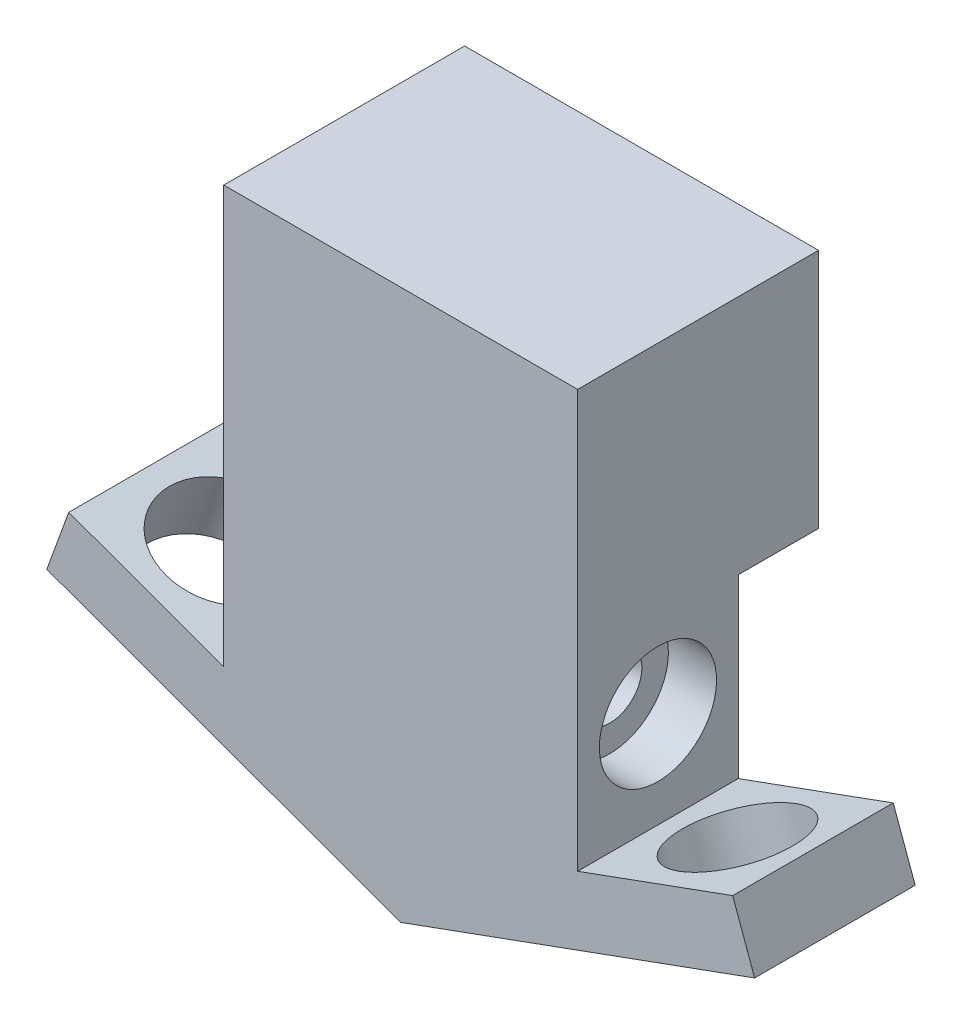
ISO-10303-21;
HEADER;
FILE_DESCRIPTION(('STEP AP214'),'2;1');
FILE_NAME('part.step','',(''),(''),'','','');
FILE_SCHEMA(('AUTOMOTIVE_DESIGN { 1 0 10303 214 1 1 1 1 }'));
ENDSEC;
DATA;
#1=APPLICATION_CONTEXT('core data for automotive mechanical design processes');
#2=APPLICATION_PROTOCOL_DEFINITION('international standard','automotive_design',2000,#1);
#3=PRODUCT_CONTEXT('',#1,'mechanical');
#4=PRODUCT('Part','Part','',(#3));
#5=PRODUCT_RELATED_PRODUCT_CATEGORY('part','',(#4));
#6=PRODUCT_DEFINITION_FORMATION('','',#4);
#7=PRODUCT_DEFINITION_CONTEXT('part definition',#1,'design');
#8=PRODUCT_DEFINITION('design','',#6,#7);
#9=PRODUCT_DEFINITION_SHAPE('','',#8);
#10=(LENGTH_UNIT() NAMED_UNIT(*) SI_UNIT(.MILLI.,.METRE.));
#11=(NAMED_UNIT(*) PLANE_ANGLE_UNIT() SI_UNIT($,.RADIAN.));
#12=(NAMED_UNIT(*) SI_UNIT($,.STERADIAN.) SOLID_ANGLE_UNIT());
#13=UNCERTAINTY_MEASURE_WITH_UNIT(LENGTH_MEASURE(1.E-05),#10,'distance_accuracy_value','');
#14=(GEOMETRIC_REPRESENTATION_CONTEXT(3) GLOBAL_UNCERTAINTY_ASSIGNED_CONTEXT((#13)) GLOBAL_UNIT_ASSIGNED_CONTEXT((#10,
#11,#12)) REPRESENTATION_CONTEXT('',''));
#15=CARTESIAN_POINT('',(0.,0.,0.));
#16=DIRECTION('',(0.,0.,1.));
#17=DIRECTION('',(1.,0.,0.));
#18=AXIS2_PLACEMENT_3D('',#15,#16,#17);
#19=CARTESIAN_POINT('',(0.,0.,10.));
#20=DIRECTION('',(-0.342020143325666,-0.939692620785909,0.));
#21=DIRECTION('',(0.939692620785909,-0.342020143325666,0.));
#22=AXIS2_PLACEMENT_3D('',#19,#20,#21);
#23=PLANE('',#22);
#24=CARTESIAN_POINT('',(-15.9747745533605,5.81434243653633,5.));
#25=DIRECTION('',(-0.342020143325666,-0.939692620785909,0.));
#26=DIRECTION('',(0.939692620785909,-0.342020143325666,0.));
#27=AXIS2_PLACEMENT_3D('',#24,#25,#26);
#28=CIRCLE('',#27,3.65);
#29=CARTESIAN_POINT('',(-12.5448964874919,4.56596891339764,5.));
#30=VERTEX_POINT('',#29);
#31=EDGE_CURVE('E194',#30,#30,#28,.T.);
#32=ORIENTED_EDGE('',*,*,#31,.T.);
#33=EDGE_LOOP('',(#32));
#34=FACE_BOUND('',#33,.T.);
#35=DIRECTION('',(-0.939692620785909,0.342020143325666,0.));
#36=VECTOR('',#35,1.);
#37=CARTESIAN_POINT('',(0.,0.,10.));
#38=LINE('',#37,#36);
#39=CARTESIAN_POINT('',(-11.0206591152963,4.01119187996233,10.));
#40=VERTEX_POINT('',#39);
#41=CARTESIAN_POINT('',(-20.67323765729,7.52444315316466,10.));
#42=VERTEX_POINT('',#41);
#43=EDGE_CURVE('E62',#40,#42,#38,.T.);
#44=ORIENTED_EDGE('',*,*,#43,.F.);
#45=DIRECTION('',(0.,0.,-1.));
#46=VECTOR('',#45,1.);
#47=CARTESIAN_POINT('',(-11.0206591152963,4.01119187996233,10.));
#48=LINE('',#47,#46);
#49=CARTESIAN_POINT('',(-11.0206591152963,4.01119187996233,0.));
#50=VERTEX_POINT('',#49);
#51=EDGE_CURVE('E192',#40,#50,#48,.T.);
#52=ORIENTED_EDGE('',*,*,#51,.T.);
#53=DIRECTION('',(-0.939692620785909,0.342020143325666,0.));
#54=VECTOR('',#53,1.);
#55=CARTESIAN_POINT('',(0.,0.,0.));
#56=LINE('',#55,#54);
#57=CARTESIAN_POINT('',(-20.67323765729,7.52444315316466,0.));
#58=VERTEX_POINT('',#57);
#59=EDGE_CURVE('E203',#50,#58,#56,.T.);
#60=ORIENTED_EDGE('',*,*,#59,.T.);
#61=DIRECTION('',(0.,0.,-1.));
#62=VECTOR('',#61,1.);
#63=CARTESIAN_POINT('',(-20.67323765729,7.52444315316466,10.));
#64=LINE('',#63,#62);
#65=EDGE_CURVE('E11',#42,#58,#64,.T.);
#66=ORIENTED_EDGE('',*,*,#65,.F.);
#67=EDGE_LOOP('',(#44,#52,#60,#66));
#68=FACE_BOUND('',#67,.T.);
#69=ADVANCED_FACE('F39',(#34,#68),#23,.F.);
#70=CARTESIAN_POINT('',(-20.67323765729,7.52444315316466,10.));
#71=DIRECTION('',(0.93969262078591,-0.342020143325664,0.));
#72=DIRECTION('',(0.342020143325664,0.93969262078591,0.));
#73=AXIS2_PLACEMENT_3D('',#70,#71,#72);
#74=PLANE('',#73);
#75=DIRECTION('',(-0.342020143325664,-0.93969262078591,0.));
#76=VECTOR('',#75,1.);
#77=CARTESIAN_POINT('',(-20.67323765729,7.52444315316466,0.));
#78=LINE('',#77,#76);
#79=CARTESIAN_POINT('',(-22.0413182305927,3.76567267002102,0.));
#80=VERTEX_POINT('',#79);
#81=EDGE_CURVE('E218',#58,#80,#78,.T.);
#82=ORIENTED_EDGE('',*,*,#81,.T.);
#83=DIRECTION('',(0.,0.,-1.));
#84=VECTOR('',#83,1.);
#85=CARTESIAN_POINT('',(-22.0413182305927,3.76567267002102,10.));
#86=LINE('',#85,#84);
#87=CARTESIAN_POINT('',(-22.0413182305927,3.76567267002102,10.));
#88=VERTEX_POINT('',#87);
#89=EDGE_CURVE('E47',#88,#80,#86,.T.);
#90=ORIENTED_EDGE('',*,*,#89,.F.);
#91=DIRECTION('',(-0.342020143325664,-0.93969262078591,0.));
#92=VECTOR('',#91,1.);
#93=CARTESIAN_POINT('',(-20.67323765729,7.52444315316466,10.));
#94=LINE('',#93,#92);
#95=EDGE_CURVE('E205',#42,#88,#94,.T.);
#96=ORIENTED_EDGE('',*,*,#95,.F.);
#97=ORIENTED_EDGE('',*,*,#65,.T.);
#98=EDGE_LOOP('',(#82,#90,#96,#97));
#99=FACE_BOUND('',#98,.T.);
#100=ADVANCED_FACE('F261',(#99),#74,.F.);
#101=CARTESIAN_POINT('',(-22.0413182305927,3.76567267002102,10.));
#102=DIRECTION('',(0.342020143325666,0.939692620785909,0.));
#103=DIRECTION('',(-0.939692620785909,0.342020143325666,0.));
#104=AXIS2_PLACEMENT_3D('',#101,#102,#103);
#105=PLANE('',#104);
#106=CARTESIAN_POINT('',(-17.3428551266631,2.05557195339269,5.));
#107=DIRECTION('',(0.342020143325666,0.939692620785909,0.));
#108=DIRECTION('',(-0.939692620785909,0.342020143325666,0.));
#109=AXIS2_PLACEMENT_3D('',#106,#107,#108);
#110=CIRCLE('',#109,3.65);
#111=CARTESIAN_POINT('',(-20.7727331925317,3.30394547653138,5.));
#112=VERTEX_POINT('',#111);
#113=EDGE_CURVE('E42',#112,#112,#110,.F.);
#114=ORIENTED_EDGE('',*,*,#113,.F.);
#115=EDGE_LOOP('',(#114));
#116=FACE_BOUND('',#115,.T.);
#117=DIRECTION('',(0.939692620785909,-0.342020143325666,0.));
#118=VECTOR('',#117,1.);
#119=CARTESIAN_POINT('',(-22.0413182305927,3.76567267002102,0.));
#120=LINE('',#119,#118);
#121=CARTESIAN_POINT('',(0.,-4.25671108990365,0.));
#122=VERTEX_POINT('',#121);
#123=EDGE_CURVE('E220',#80,#122,#120,.T.);
#124=ORIENTED_EDGE('',*,*,#123,.T.);
#125=DIRECTION('',(0.,0.,-1.));
#126=VECTOR('',#125,1.);
#127=CARTESIAN_POINT('',(0.,-4.25671108990365,10.));
#128=LINE('',#127,#126);
#129=CARTESIAN_POINT('',(0.,-4.25671108990365,10.));
#130=VERTEX_POINT('',#129);
#131=EDGE_CURVE('E232',#130,#122,#128,.T.);
#132=ORIENTED_EDGE('',*,*,#131,.F.);
#133=DIRECTION('',(0.939692620785909,-0.342020143325666,0.));
#134=VECTOR('',#133,1.);
#135=CARTESIAN_POINT('',(-22.0413182305927,3.76567267002102,10.));
#136=LINE('',#135,#134);
#137=EDGE_CURVE('E208',#88,#130,#136,.T.);
#138=ORIENTED_EDGE('',*,*,#137,.F.);
#139=ORIENTED_EDGE('',*,*,#89,.T.);
#140=EDGE_LOOP('',(#124,#132,#138,#139));
#141=FACE_BOUND('',#140,.T.);
#142=ADVANCED_FACE('F240',(#116,#141),#105,.F.);
#143=CARTESIAN_POINT('',(22.0413182305927,3.76567267002102,10.));
#144=DIRECTION('',(-0.342020143325667,0.939692620785909,0.));
#145=DIRECTION('',(-0.939692620785909,-0.342020143325667,0.));
#146=AXIS2_PLACEMENT_3D('',#143,#144,#145);
#147=PLANE('',#146);
#148=CARTESIAN_POINT('',(17.3428551266631,2.05557195339269,5.));
#149=DIRECTION('',(-0.342020143325667,0.939692620785909,0.));
#150=DIRECTION('',(-0.939692620785909,-0.342020143325667,0.));
#151=AXIS2_PLACEMENT_3D('',#148,#149,#150);
#152=CIRCLE('',#151,3.65);
#153=CARTESIAN_POINT('',(13.9129770607946,0.807198430254004,5.));
#154=VERTEX_POINT('',#153);
#155=EDGE_CURVE('E200',#154,#154,#152,.F.);
#156=ORIENTED_EDGE('',*,*,#155,.F.);
#157=EDGE_LOOP('',(#156));
#158=FACE_BOUND('',#157,.T.);
#159=DIRECTION('',(0.,0.,-1.));
#160=VECTOR('',#159,1.);
#161=CARTESIAN_POINT('',(22.0413182305927,3.76567267002102,10.));
#162=LINE('',#161,#160);
#163=CARTESIAN_POINT('',(22.0413182305927,3.76567267002102,10.));
#164=VERTEX_POINT('',#163);
#165=CARTESIAN_POINT('',(22.0413182305927,3.76567267002102,0.));
#166=VERTEX_POINT('',#165);
#167=EDGE_CURVE('E229',#164,#166,#162,.T.);
#168=ORIENTED_EDGE('',*,*,#167,.F.);
#169=DIRECTION('',(0.939692620785909,0.342020143325667,0.));
#170=VECTOR('',#169,1.);
#171=CARTESIAN_POINT('',(22.0413182305927,3.76567267002102,10.));
#172=LINE('',#171,#170);
#173=EDGE_CURVE('E210',#130,#164,#172,.T.);
#174=ORIENTED_EDGE('',*,*,#173,.F.);
#175=ORIENTED_EDGE('',*,*,#131,.T.);
#176=DIRECTION('',(0.939692620785909,0.342020143325667,0.));
#177=VECTOR('',#176,1.);
#178=CARTESIAN_POINT('',(22.0413182305927,3.76567267002102,0.));
#179=LINE('',#178,#177);
#180=EDGE_CURVE('E222',#122,#166,#179,.T.);
#181=ORIENTED_EDGE('',*,*,#180,.T.);
#182=EDGE_LOOP('',(#168,#174,#175,#181));
#183=FACE_BOUND('',#182,.T.);
#184=ADVANCED_FACE('F253',(#158,#183),#147,.F.);
#185=CARTESIAN_POINT('',(20.67323765729,7.52444315316466,10.));
#186=DIRECTION('',(-0.93969262078591,-0.342020143325664,0.));
#187=DIRECTION('',(0.342020143325664,-0.93969262078591,0.));
#188=AXIS2_PLACEMENT_3D('',#185,#186,#187);
#189=PLANE('',#188);
#190=DIRECTION('',(-0.342020143325664,0.93969262078591,0.));
#191=VECTOR('',#190,1.);
#192=CARTESIAN_POINT('',(20.67323765729,7.52444315316466,0.));
#193=LINE('',#192,#191);
#194=CARTESIAN_POINT('',(20.67323765729,7.52444315316466,0.));
#195=VERTEX_POINT('',#194);
#196=EDGE_CURVE('E224',#166,#195,#193,.T.);
#197=ORIENTED_EDGE('',*,*,#196,.T.);
#198=DIRECTION('',(0.,0.,-1.));
#199=VECTOR('',#198,1.);
#200=CARTESIAN_POINT('',(20.67323765729,7.52444315316466,10.));
#201=LINE('',#200,#199);
#202=CARTESIAN_POINT('',(20.67323765729,7.52444315316466,10.));
#203=VERTEX_POINT('',#202);
#204=EDGE_CURVE('E216',#203,#195,#201,.T.);
#205=ORIENTED_EDGE('',*,*,#204,.F.);
#206=DIRECTION('',(-0.342020143325664,0.93969262078591,0.));
#207=VECTOR('',#206,1.);
#208=CARTESIAN_POINT('',(20.67323765729,7.52444315316466,10.));
#209=LINE('',#208,#207);
#210=EDGE_CURVE('E212',#164,#203,#209,.T.);
#211=ORIENTED_EDGE('',*,*,#210,.F.);
#212=ORIENTED_EDGE('',*,*,#167,.T.);
#213=EDGE_LOOP('',(#197,#205,#211,#212));
#214=FACE_BOUND('',#213,.T.);
#215=ADVANCED_FACE('F257',(#214),#189,.F.);
#216=CARTESIAN_POINT('',(0.,0.,10.));
#217=DIRECTION('',(0.342020143325666,-0.939692620785909,0.));
#218=DIRECTION('',(0.939692620785909,0.342020143325666,0.));
#219=AXIS2_PLACEMENT_3D('',#216,#217,#218);
#220=PLANE('',#219);
#221=CARTESIAN_POINT('',(15.9747745533605,5.81434243653633,5.));
#222=DIRECTION('',(-0.342020143325666,0.939692620785909,0.));
#223=DIRECTION('',(-0.939692620785909,-0.342020143325666,0.));
#224=AXIS2_PLACEMENT_3D('',#221,#222,#223);
#225=CIRCLE('',#224,3.65);
#226=CARTESIAN_POINT('',(12.5448964874919,4.56596891339764,5.));
#227=VERTEX_POINT('',#226);
#228=EDGE_CURVE('E197',#227,#227,#225,.T.);
#229=ORIENTED_EDGE('',*,*,#228,.F.);
#230=EDGE_LOOP('',(#229));
#231=FACE_BOUND('',#230,.T.);
#232=DIRECTION('',(-0.939692620785909,-0.342020143325666,0.));
#233=VECTOR('',#232,1.);
#234=CARTESIAN_POINT('',(0.,0.,0.));
#235=LINE('',#234,#233);
#236=CARTESIAN_POINT('',(11.0206591152963,4.01119187996233,0.));
#237=VERTEX_POINT('',#236);
#238=EDGE_CURVE('E206',#195,#237,#235,.T.);
#239=ORIENTED_EDGE('',*,*,#238,.T.);
#240=DIRECTION('',(0.,0.,1.));
#241=VECTOR('',#240,1.);
#242=CARTESIAN_POINT('',(11.0206591152963,4.01119187996233,10.));
#243=LINE('',#242,#241);
#244=CARTESIAN_POINT('',(11.0206591152963,4.01119187996233,10.));
#245=VERTEX_POINT('',#244);
#246=EDGE_CURVE('E54',#237,#245,#243,.T.);
#247=ORIENTED_EDGE('',*,*,#246,.T.);
#248=DIRECTION('',(-0.939692620785909,-0.342020143325666,0.));
#249=VECTOR('',#248,1.);
#250=CARTESIAN_POINT('',(0.,0.,10.));
#251=LINE('',#250,#249);
#252=EDGE_CURVE('E214',#203,#245,#251,.T.);
#253=ORIENTED_EDGE('',*,*,#252,.F.);
#254=ORIENTED_EDGE('',*,*,#204,.T.);
#255=EDGE_LOOP('',(#239,#247,#253,#254));
#256=FACE_BOUND('',#255,.T.);
#257=ADVANCED_FACE('F268',(#231,#256),#220,.F.);
#258=CARTESIAN_POINT('',(0.,0.,10.));
#259=DIRECTION('',(0.,0.,1.));
#260=DIRECTION('',(1.,0.,0.));
#261=AXIS2_PLACEMENT_3D('',#258,#259,#260);
#262=PLANE('',#261);
#263=DIRECTION('',(0.,-1.,0.));
#264=VECTOR('',#263,1.);
#265=CARTESIAN_POINT('',(-11.0206591152963,-0.245519209941317,10.));
#266=LINE('',#265,#264);
#267=CARTESIAN_POINT('',(-11.0206591152963,30.,10.));
#268=VERTEX_POINT('',#267);
#269=EDGE_CURVE('E182',#268,#40,#266,.T.);
#270=ORIENTED_EDGE('',*,*,#269,.T.);
#271=ORIENTED_EDGE('',*,*,#43,.T.);
#272=ORIENTED_EDGE('',*,*,#95,.T.);
#273=ORIENTED_EDGE('',*,*,#137,.T.);
#274=ORIENTED_EDGE('',*,*,#173,.T.);
#275=ORIENTED_EDGE('',*,*,#210,.T.);
#276=ORIENTED_EDGE('',*,*,#252,.T.);
#277=DIRECTION('',(0.,1.,0.));
#278=VECTOR('',#277,1.);
#279=CARTESIAN_POINT('',(11.0206591152963,15.,10.));
#280=LINE('',#279,#278);
#281=CARTESIAN_POINT('',(11.0206591152963,30.,10.));
#282=VERTEX_POINT('',#281);
#283=EDGE_CURVE('E175',#245,#282,#280,.T.);
#284=ORIENTED_EDGE('',*,*,#283,.T.);
#285=DIRECTION('',(-1.,0.,0.));
#286=VECTOR('',#285,1.);
#287=CARTESIAN_POINT('',(32.2338625508928,30.,10.));
#288=LINE('',#287,#286);
#289=EDGE_CURVE('E147',#282,#268,#288,.T.);
#290=ORIENTED_EDGE('',*,*,#289,.T.);
#291=EDGE_LOOP('',(#270,#271,#272,#273,#274,#275,#276,#284,#290));
#292=FACE_BOUND('',#291,.T.);
#293=ADVANCED_FACE('F260',(#292),#262,.T.);
#294=CARTESIAN_POINT('',(0.,0.,0.));
#295=DIRECTION('',(0.,0.,1.));
#296=DIRECTION('',(1.,0.,0.));
#297=AXIS2_PLACEMENT_3D('',#294,#295,#296);
#298=PLANE('',#297);
#299=ORIENTED_EDGE('',*,*,#59,.F.);
#300=DIRECTION('',(0.,1.,0.));
#301=VECTOR('',#300,1.);
#302=CARTESIAN_POINT('',(-11.0206591152963,-0.245519209941317,0.));
#303=LINE('',#302,#301);
#304=CARTESIAN_POINT('',(-11.0206591152963,15.,0.));
#305=VERTEX_POINT('',#304);
#306=EDGE_CURVE('E181',#50,#305,#303,.T.);
#307=ORIENTED_EDGE('',*,*,#306,.T.);
#308=DIRECTION('',(1.,0.,0.));
#309=VECTOR('',#308,1.);
#310=CARTESIAN_POINT('',(-11.0206591152963,15.,0.));
#311=LINE('',#310,#309);
#312=CARTESIAN_POINT('',(11.0206591152963,15.,0.));
#313=VERTEX_POINT('',#312);
#314=EDGE_CURVE('E178',#305,#313,#311,.T.);
#315=ORIENTED_EDGE('',*,*,#314,.T.);
#316=DIRECTION('',(0.,-1.,0.));
#317=VECTOR('',#316,1.);
#318=CARTESIAN_POINT('',(11.0206591152963,15.,0.));
#319=LINE('',#318,#317);
#320=EDGE_CURVE('E185',#313,#237,#319,.T.);
#321=ORIENTED_EDGE('',*,*,#320,.T.);
#322=ORIENTED_EDGE('',*,*,#238,.F.);
#323=ORIENTED_EDGE('',*,*,#196,.F.);
#324=ORIENTED_EDGE('',*,*,#180,.F.);
#325=ORIENTED_EDGE('',*,*,#123,.F.);
#326=ORIENTED_EDGE('',*,*,#81,.F.);
#327=EDGE_LOOP('',(#299,#307,#315,#321,#322,#323,#324,#325,#326));
#328=FACE_BOUND('',#327,.T.);
#329=ADVANCED_FACE('F248',(#328),#298,.F.);
#330=CARTESIAN_POINT('',(20.8737886613235,-7.64558820268198,5.));
#331=DIRECTION('',(-0.342020143325666,0.939692620785909,0.));
#332=DIRECTION('',(-0.939692620785909,-0.342020143325666,0.));
#333=AXIS2_PLACEMENT_3D('',#330,#331,#332);
#334=CYLINDRICAL_SURFACE('',#333,3.65);
#335=ORIENTED_EDGE('',*,*,#155,.T.);
#336=EDGE_LOOP('',(#335));
#337=FACE_BOUND('',#336,.T.);
#338=ORIENTED_EDGE('',*,*,#228,.T.);
#339=EDGE_LOOP('',(#338));
#340=FACE_BOUND('',#339,.T.);
#341=ADVANCED_FACE('F291',(#337,#340),#334,.F.);
#342=CARTESIAN_POINT('',(-26.7096094546566,-23.6793740563484,5.));
#343=DIRECTION('',(0.342020143325666,0.939692620785909,0.));
#344=DIRECTION('',(-0.939692620785909,0.342020143325666,0.));
#345=AXIS2_PLACEMENT_3D('',#342,#343,#344);
#346=CYLINDRICAL_SURFACE('',#345,3.65);
#347=ORIENTED_EDGE('',*,*,#31,.F.);
#348=EDGE_LOOP('',(#347));
#349=FACE_BOUND('',#348,.T.);
#350=ORIENTED_EDGE('',*,*,#113,.T.);
#351=EDGE_LOOP('',(#350));
#352=FACE_BOUND('',#351,.T.);
#353=ADVANCED_FACE('F288',(#349,#352),#346,.F.);
#354=CARTESIAN_POINT('',(-11.0206591152963,-0.245519209941317,-29.2684237932669));
#355=DIRECTION('',(-1.,0.,0.));
#356=DIRECTION('',(0.,0.,1.));
#357=AXIS2_PLACEMENT_3D('',#354,#355,#356);
#358=PLANE('',#357);
#359=CARTESIAN_POINT('',(-11.0206591152963,10.,5.));
#360=DIRECTION('',(1.,0.,0.));
#361=DIRECTION('',(0.,1.,0.));
#362=AXIS2_PLACEMENT_3D('',#359,#360,#361);
#363=CIRCLE('',#362,3.65);
#364=CARTESIAN_POINT('',(-11.0206591152963,13.65,5.));
#365=VERTEX_POINT('',#364);
#366=EDGE_CURVE('E165',#365,#365,#363,.T.);
#367=ORIENTED_EDGE('',*,*,#366,.T.);
#368=EDGE_LOOP('',(#367));
#369=FACE_BOUND('',#368,.T.);
#370=ORIENTED_EDGE('',*,*,#51,.F.);
#371=ORIENTED_EDGE('',*,*,#269,.F.);
#372=DIRECTION('',(0.,0.,-1.));
#373=VECTOR('',#372,1.);
#374=CARTESIAN_POINT('',(-11.0206591152963,30.,10.));
#375=LINE('',#374,#373);
#376=CARTESIAN_POINT('',(-11.0206591152963,30.,-5.));
#377=VERTEX_POINT('',#376);
#378=EDGE_CURVE('E154',#268,#377,#375,.T.);
#379=ORIENTED_EDGE('',*,*,#378,.T.);
#380=DIRECTION('',(0.,-1.,0.));
#381=VECTOR('',#380,1.);
#382=CARTESIAN_POINT('',(-11.0206591152963,15.,-5.));
#383=LINE('',#382,#381);
#384=CARTESIAN_POINT('',(-11.0206591152963,15.,-5.));
#385=VERTEX_POINT('',#384);
#386=EDGE_CURVE('E140',#377,#385,#383,.T.);
#387=ORIENTED_EDGE('',*,*,#386,.T.);
#388=DIRECTION('',(0.,0.,1.));
#389=VECTOR('',#388,1.);
#390=CARTESIAN_POINT('',(-11.0206591152963,15.,10.));
#391=LINE('',#390,#389);
#392=EDGE_CURVE('E148',#385,#305,#391,.T.);
#393=ORIENTED_EDGE('',*,*,#392,.T.);
#394=ORIENTED_EDGE('',*,*,#306,.F.);
#395=EDGE_LOOP('',(#370,#371,#379,#387,#393,#394));
#396=FACE_BOUND('',#395,.T.);
#397=ADVANCED_FACE('F264',(#369,#396),#358,.T.);
#398=CARTESIAN_POINT('',(11.0206591152963,15.,-29.2684237932669));
#399=DIRECTION('',(1.,0.,0.));
#400=DIRECTION('',(0.,1.,0.));
#401=AXIS2_PLACEMENT_3D('',#398,#399,#400);
#402=PLANE('',#401);
#403=CARTESIAN_POINT('',(11.0206591152963,10.,5.));
#404=DIRECTION('',(1.,0.,0.));
#405=DIRECTION('',(0.,1.,0.));
#406=AXIS2_PLACEMENT_3D('',#403,#404,#405);
#407=CIRCLE('',#406,3.65);
#408=CARTESIAN_POINT('',(11.0206591152963,13.65,5.));
#409=VERTEX_POINT('',#408);
#410=EDGE_CURVE('E169',#409,#409,#407,.T.);
#411=ORIENTED_EDGE('',*,*,#410,.F.);
#412=EDGE_LOOP('',(#411));
#413=FACE_BOUND('',#412,.T.);
#414=ORIENTED_EDGE('',*,*,#246,.F.);
#415=ORIENTED_EDGE('',*,*,#320,.F.);
#416=DIRECTION('',(0.,0.,1.));
#417=VECTOR('',#416,1.);
#418=CARTESIAN_POINT('',(11.0206591152963,15.,10.));
#419=LINE('',#418,#417);
#420=CARTESIAN_POINT('',(11.0206591152963,15.,-5.));
#421=VERTEX_POINT('',#420);
#422=EDGE_CURVE('E131',#421,#313,#419,.T.);
#423=ORIENTED_EDGE('',*,*,#422,.F.);
#424=DIRECTION('',(0.,-1.,0.));
#425=VECTOR('',#424,1.);
#426=CARTESIAN_POINT('',(11.0206591152963,15.,-5.));
#427=LINE('',#426,#425);
#428=CARTESIAN_POINT('',(11.0206591152963,30.,-5.));
#429=VERTEX_POINT('',#428);
#430=EDGE_CURVE('E123',#429,#421,#427,.T.);
#431=ORIENTED_EDGE('',*,*,#430,.F.);
#432=DIRECTION('',(0.,0.,-1.));
#433=VECTOR('',#432,1.);
#434=CARTESIAN_POINT('',(11.0206591152963,30.,10.));
#435=LINE('',#434,#433);
#436=EDGE_CURVE('E128',#282,#429,#435,.T.);
#437=ORIENTED_EDGE('',*,*,#436,.F.);
#438=ORIENTED_EDGE('',*,*,#283,.F.);
#439=EDGE_LOOP('',(#414,#415,#423,#431,#437,#438));
#440=FACE_BOUND('',#439,.T.);
#441=ADVANCED_FACE('F125',(#413,#440),#402,.T.);
#442=CARTESIAN_POINT('',(8.02065911529634,10.,5.));
#443=DIRECTION('',(1.,0.,0.));
#444=DIRECTION('',(0.,1.,0.));
#445=AXIS2_PLACEMENT_3D('',#442,#443,#444);
#446=CYLINDRICAL_SURFACE('',#445,3.65);
#447=CARTESIAN_POINT('',(8.02065911529634,10.,5.));
#448=DIRECTION('',(1.,0.,0.));
#449=DIRECTION('',(0.,1.,0.));
#450=AXIS2_PLACEMENT_3D('',#447,#448,#449);
#451=CIRCLE('',#450,3.65);
#452=CARTESIAN_POINT('',(8.02065911529634,13.65,5.));
#453=VERTEX_POINT('',#452);
#454=EDGE_CURVE('E172',#453,#453,#451,.T.);
#455=ORIENTED_EDGE('',*,*,#454,.F.);
#456=EDGE_LOOP('',(#455));
#457=FACE_BOUND('',#456,.T.);
#458=ORIENTED_EDGE('',*,*,#410,.T.);
#459=EDGE_LOOP('',(#458));
#460=FACE_BOUND('',#459,.T.);
#461=ADVANCED_FACE('F316',(#457,#460),#446,.F.);
#462=CARTESIAN_POINT('',(8.02065911529634,10.,5.));
#463=DIRECTION('',(1.,0.,0.));
#464=DIRECTION('',(0.,1.,0.));
#465=AXIS2_PLACEMENT_3D('',#462,#463,#464);
#466=PLANE('',#465);
#467=CARTESIAN_POINT('',(8.02065911529634,9.99999999999999,5.));
#468=DIRECTION('',(1.,0.,0.));
#469=DIRECTION('',(0.,1.,0.));
#470=AXIS2_PLACEMENT_3D('',#467,#468,#469);
#471=CIRCLE('',#470,2.);
#472=CARTESIAN_POINT('',(8.02065911529634,12.,5.));
#473=VERTEX_POINT('',#472);
#474=EDGE_CURVE('E162',#473,#473,#471,.F.);
#475=ORIENTED_EDGE('',*,*,#474,.T.);
#476=EDGE_LOOP('',(#475));
#477=FACE_BOUND('',#476,.T.);
#478=ORIENTED_EDGE('',*,*,#454,.T.);
#479=EDGE_LOOP('',(#478));
#480=FACE_BOUND('',#479,.T.);
#481=ADVANCED_FACE('F323',(#477,#480),#466,.T.);
#482=CARTESIAN_POINT('',(-8.02065911529634,10.,5.));
#483=DIRECTION('',(-1.,0.,0.));
#484=DIRECTION('',(0.,-1.,0.));
#485=AXIS2_PLACEMENT_3D('',#482,#483,#484);
#486=CYLINDRICAL_SURFACE('',#485,3.65);
#487=CARTESIAN_POINT('',(-8.02065911529634,10.,5.));
#488=DIRECTION('',(1.,0.,0.));
#489=DIRECTION('',(0.,1.,0.));
#490=AXIS2_PLACEMENT_3D('',#487,#488,#489);
#491=CIRCLE('',#490,3.65);
#492=CARTESIAN_POINT('',(-8.02065911529634,13.65,5.));
#493=VERTEX_POINT('',#492);
#494=EDGE_CURVE('E166',#493,#493,#491,.T.);
#495=ORIENTED_EDGE('',*,*,#494,.T.);
#496=EDGE_LOOP('',(#495));
#497=FACE_BOUND('',#496,.T.);
#498=ORIENTED_EDGE('',*,*,#366,.F.);
#499=EDGE_LOOP('',(#498));
#500=FACE_BOUND('',#499,.T.);
#501=ADVANCED_FACE('F327',(#497,#500),#486,.F.);
#502=CARTESIAN_POINT('',(-8.02065911529634,10.,5.));
#503=DIRECTION('',(-1.,0.,0.));
#504=DIRECTION('',(0.,1.,0.));
#505=AXIS2_PLACEMENT_3D('',#502,#503,#504);
#506=PLANE('',#505);
#507=CARTESIAN_POINT('',(-8.02065911529634,10.,5.));
#508=DIRECTION('',(-1.,0.,0.));
#509=DIRECTION('',(0.,-1.,0.));
#510=AXIS2_PLACEMENT_3D('',#507,#508,#509);
#511=CIRCLE('',#510,2.);
#512=CARTESIAN_POINT('',(-8.02065911529634,8.,5.));
#513=VERTEX_POINT('',#512);
#514=EDGE_CURVE('E159',#513,#513,#511,.T.);
#515=ORIENTED_EDGE('',*,*,#514,.F.);
#516=EDGE_LOOP('',(#515));
#517=FACE_BOUND('',#516,.T.);
#518=ORIENTED_EDGE('',*,*,#494,.F.);
#519=EDGE_LOOP('',(#518));
#520=FACE_BOUND('',#519,.T.);
#521=ADVANCED_FACE('F331',(#517,#520),#506,.T.);
#522=CARTESIAN_POINT('',(13.6775133647887,9.99999999999999,5.));
#523=DIRECTION('',(-1.,0.,0.));
#524=DIRECTION('',(0.,-1.,0.));
#525=AXIS2_PLACEMENT_3D('',#522,#523,#524);
#526=CYLINDRICAL_SURFACE('',#525,2.);
#527=ORIENTED_EDGE('',*,*,#514,.T.);
#528=EDGE_LOOP('',(#527));
#529=FACE_BOUND('',#528,.T.);
#530=ORIENTED_EDGE('',*,*,#474,.F.);
#531=EDGE_LOOP('',(#530));
#532=FACE_BOUND('',#531,.T.);
#533=ADVANCED_FACE('F335',(#529,#532),#526,.F.);
#534=CARTESIAN_POINT('',(32.2338625508928,15.,10.));
#535=DIRECTION('',(0.,-1.,0.));
#536=DIRECTION('',(0.,0.,-1.));
#537=AXIS2_PLACEMENT_3D('',#534,#535,#536);
#538=PLANE('',#537);
#539=ORIENTED_EDGE('',*,*,#314,.F.);
#540=ORIENTED_EDGE('',*,*,#392,.F.);
#541=DIRECTION('',(-1.,0.,0.));
#542=VECTOR('',#541,1.);
#543=CARTESIAN_POINT('',(32.2338625508928,15.,-5.));
#544=LINE('',#543,#542);
#545=EDGE_CURVE('E134',#421,#385,#544,.T.);
#546=ORIENTED_EDGE('',*,*,#545,.F.);
#547=ORIENTED_EDGE('',*,*,#422,.T.);
#548=EDGE_LOOP('',(#539,#540,#546,#547));
#549=FACE_BOUND('',#548,.T.);
#550=ADVANCED_FACE('F267',(#549),#538,.T.);
#551=CARTESIAN_POINT('',(32.2338625508928,30.,10.));
#552=DIRECTION('',(0.,1.,0.));
#553=DIRECTION('',(0.,0.,1.));
#554=AXIS2_PLACEMENT_3D('',#551,#552,#553);
#555=PLANE('',#554);
#556=ORIENTED_EDGE('',*,*,#289,.F.);
#557=ORIENTED_EDGE('',*,*,#436,.T.);
#558=DIRECTION('',(-1.,0.,0.));
#559=VECTOR('',#558,1.);
#560=CARTESIAN_POINT('',(32.2338625508928,30.,-5.));
#561=LINE('',#560,#559);
#562=EDGE_CURVE('E135',#429,#377,#561,.T.);
#563=ORIENTED_EDGE('',*,*,#562,.T.);
#564=ORIENTED_EDGE('',*,*,#378,.F.);
#565=EDGE_LOOP('',(#556,#557,#563,#564));
#566=FACE_BOUND('',#565,.T.);
#567=ADVANCED_FACE('F145',(#566),#555,.T.);
#568=CARTESIAN_POINT('',(32.2338625508928,15.,-5.));
#569=DIRECTION('',(0.,0.,-1.));
#570=DIRECTION('',(-1.,0.,0.));
#571=AXIS2_PLACEMENT_3D('',#568,#569,#570);
#572=PLANE('',#571);
#573=ORIENTED_EDGE('',*,*,#562,.F.);
#574=ORIENTED_EDGE('',*,*,#430,.T.);
#575=ORIENTED_EDGE('',*,*,#545,.T.);
#576=ORIENTED_EDGE('',*,*,#386,.F.);
#577=EDGE_LOOP('',(#573,#574,#575,#576));
#578=FACE_BOUND('',#577,.T.);
#579=ADVANCED_FACE('F138',(#578),#572,.T.);
#580=CLOSED_SHELL('',(#69,#100,#142,#184,#215,#257,#293,#329,#341,#353,#397,#441,#461,#481,#501,
#521,#533,#550,#567,#579));
#581=MANIFOLD_SOLID_BREP('B2',#580);
#582=ADVANCED_BREP_SHAPE_REPRESENTATION('',(#18,#581),#14);
#583=SHAPE_DEFINITION_REPRESENTATION(#9,#582);
ENDSEC;
END-ISO-10303-21;
